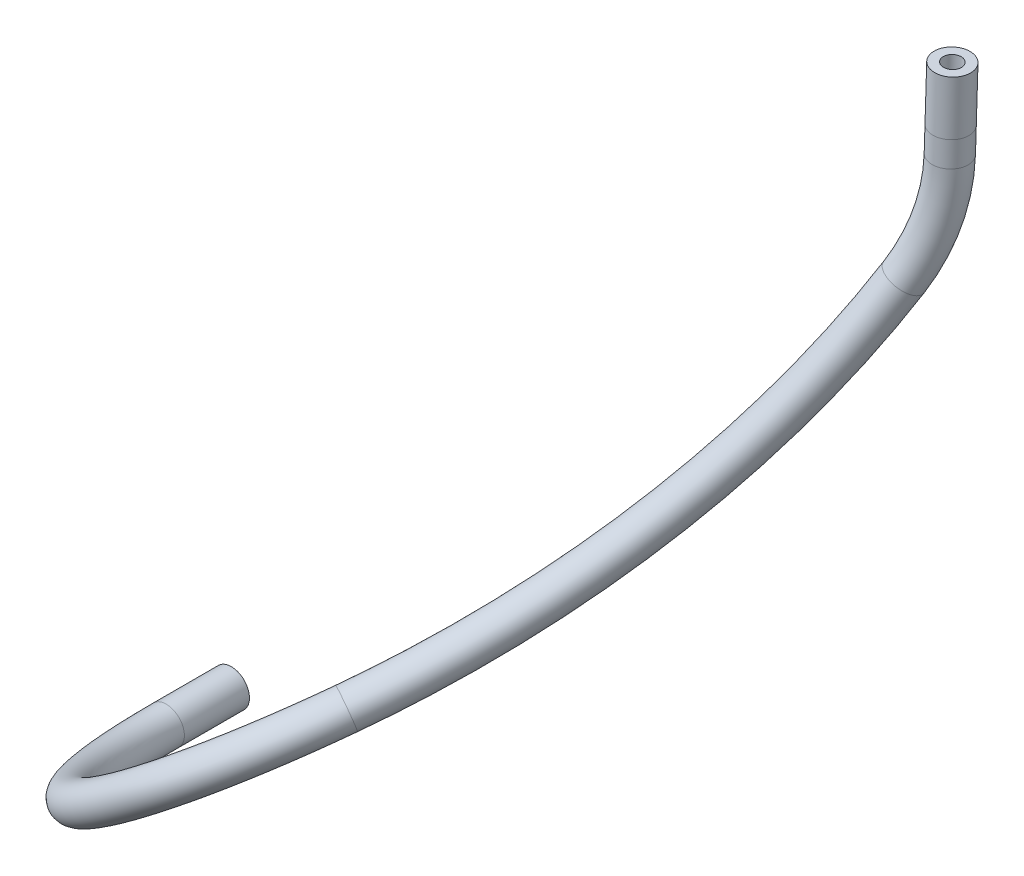
ISO-10303-21;
HEADER;
FILE_DESCRIPTION(('STEP AP214'),'2;1');
FILE_NAME('part.step','',(''),(''),'','','');
FILE_SCHEMA(('AUTOMOTIVE_DESIGN { 1 0 10303 214 1 1 1 1 }'));
ENDSEC;
DATA;
#1=APPLICATION_CONTEXT('core data for automotive mechanical design processes');
#2=APPLICATION_PROTOCOL_DEFINITION('international standard','automotive_design',2000,#1);
#3=PRODUCT_CONTEXT('',#1,'mechanical');
#4=PRODUCT('Part','Part','',(#3));
#5=PRODUCT_RELATED_PRODUCT_CATEGORY('part','',(#4));
#6=PRODUCT_DEFINITION_FORMATION('','',#4);
#7=PRODUCT_DEFINITION_CONTEXT('part definition',#1,'design');
#8=PRODUCT_DEFINITION('design','',#6,#7);
#9=PRODUCT_DEFINITION_SHAPE('','',#8);
#10=(LENGTH_UNIT() NAMED_UNIT(*) SI_UNIT(.MILLI.,.METRE.));
#11=(NAMED_UNIT(*) PLANE_ANGLE_UNIT() SI_UNIT($,.RADIAN.));
#12=(NAMED_UNIT(*) SI_UNIT($,.STERADIAN.) SOLID_ANGLE_UNIT());
#13=UNCERTAINTY_MEASURE_WITH_UNIT(LENGTH_MEASURE(1.E-05),#10,'distance_accuracy_value','');
#14=(GEOMETRIC_REPRESENTATION_CONTEXT(3) GLOBAL_UNCERTAINTY_ASSIGNED_CONTEXT((#13)) GLOBAL_UNIT_ASSIGNED_CONTEXT((#10,
#11,#12)) REPRESENTATION_CONTEXT('',''));
#15=CARTESIAN_POINT('',(0.,0.,0.));
#16=DIRECTION('',(0.,0.,1.));
#17=DIRECTION('',(1.,0.,0.));
#18=AXIS2_PLACEMENT_3D('',#15,#16,#17);
#19=CARTESIAN_POINT('',(233.82329013357,271.78645618805,-75.5066206363869));
#20=DIRECTION('',(0.0248269064084974,0.999669775287712,-0.00663061795004285));
#21=DIRECTION('',(0.211207580612371,-0.0117280765466602,-0.977370866208106));
#22=AXIS2_PLACEMENT_3D('',#19,#20,#21);
#23=PLANE('',#22);
#24=CARTESIAN_POINT('',(233.82329013357,271.78645618805,-75.5066206363869));
#25=DIRECTION('',(0.0248269064084974,0.999669775287712,-0.00663061795004285));
#26=DIRECTION('',(-0.999691751300367,0.0248274521851357,0.));
#27=AXIS2_PLACEMENT_3D('',#24,#25,#26);
#28=CIRCLE('',#27,3.175);
#29=CARTESIAN_POINT('',(230.649268823191,271.865283348737,-75.5066206363869));
#30=VERTEX_POINT('',#29);
#31=EDGE_CURVE('E98',#30,#30,#28,.T.);
#32=ORIENTED_EDGE('',*,*,#31,.F.);
#33=EDGE_LOOP('',(#32));
#34=FACE_BOUND('',#33,.T.);
#35=CARTESIAN_POINT('',(233.82329013357,271.78645618805,-75.5066206363869));
#36=DIRECTION('',(0.0248269064084974,0.999669775287712,-0.00663061795004285));
#37=DIRECTION('',(0.211207580612371,-0.0117280765466602,-0.977370866208106));
#38=AXIS2_PLACEMENT_3D('',#35,#36,#37);
#39=CIRCLE('',#38,6.35);
#40=CARTESIAN_POINT('',(240.171332754327,271.628801866674,-75.5066206363869));
#41=VERTEX_POINT('',#40);
#42=EDGE_CURVE('E95',#41,#41,#39,.T.);
#43=ORIENTED_EDGE('',*,*,#42,.T.);
#44=EDGE_LOOP('',(#43));
#45=FACE_BOUND('',#44,.T.);
#46=ADVANCED_FACE('F60',(#34,#45),#23,.T.);
#47=CARTESIAN_POINT('',(44.0922322704947,18.6667973883187,-12.9773341547457));
#48=DIRECTION('',(-2.80819323838567E-12,0.,1.));
#49=DIRECTION('',(1.,0.,2.80819323838567E-12));
#50=AXIS2_PLACEMENT_3D('',#47,#48,#49);
#51=PLANE('',#50);
#52=CARTESIAN_POINT('',(44.0922322705182,18.6667973883361,-12.9773341547457));
#53=DIRECTION('',(-2.80819323838567E-12,0.,1.));
#54=DIRECTION('',(1.,0.,2.80819323838567E-12));
#55=AXIS2_PLACEMENT_3D('',#52,#53,#54);
#56=CIRCLE('',#55,3.175);
#57=CARTESIAN_POINT('',(47.2672322705182,18.6667973883361,-12.9773341547368));
#58=VERTEX_POINT('',#57);
#59=EDGE_CURVE('E102',#58,#58,#56,.T.);
#60=ORIENTED_EDGE('',*,*,#59,.T.);
#61=EDGE_LOOP('',(#60));
#62=FACE_BOUND('',#61,.T.);
#63=CARTESIAN_POINT('',(44.0922322704947,18.6667973883187,-12.9773341547457));
#64=DIRECTION('',(-2.80819323838567E-12,0.,1.));
#65=DIRECTION('',(1.,0.,2.80819323838567E-12));
#66=AXIS2_PLACEMENT_3D('',#63,#64,#65);
#67=CIRCLE('',#66,6.35);
#68=CARTESIAN_POINT('',(50.4422322704947,18.6667973883187,-12.9773341547279));
#69=VERTEX_POINT('',#68);
#70=EDGE_CURVE('E11',#69,#69,#67,.T.);
#71=ORIENTED_EDGE('',*,*,#70,.F.);
#72=EDGE_LOOP('',(#71));
#73=FACE_BOUND('',#72,.T.);
#74=ADVANCED_FACE('F127',(#62,#73),#51,.F.);
#75=CARTESIAN_POINT('',(233.82329013357,271.78645618805,-75.5066206363869));
#76=DIRECTION('',(-0.0248269064084972,-0.999669775287712,0.00663061795004133));
#77=DIRECTION('',(0.999691751300367,-0.0248274521851356,0.));
#78=AXIS2_PLACEMENT_3D('',#75,#76,#77);
#79=CYLINDRICAL_SURFACE('',#78,6.35);
#80=CARTESIAN_POINT('',(233.347766262703,252.639211931707,-75.3796206363886));
#81=DIRECTION('',(0.0248269064084974,0.999669775287712,-0.00663061795004285));
#82=DIRECTION('',(0.211207580612371,-0.0117280765466602,-0.977370866208106));
#83=AXIS2_PLACEMENT_3D('',#80,#81,#82);
#84=CIRCLE('',#83,6.35);
#85=CARTESIAN_POINT('',(239.695808883461,252.481557610331,-75.3796206363886));
#86=VERTEX_POINT('',#85);
#87=EDGE_CURVE('E91',#86,#86,#84,.T.);
#88=CARTESIAN_POINT('',(239.695808883461,252.481557610331,-75.3796206363886));
#89=CARTESIAN_POINT('',(239.700762257115,252.681008071335,-75.3809435530552));
#90=CARTESIAN_POINT('',(239.70571563077,252.880458532338,-75.3822664697218));
#91=CARTESIAN_POINT('',(239.71562237808,253.279359454345,-75.3849123030551));
#92=CARTESIAN_POINT('',(239.720575751735,253.478809915349,-75.3862352197218));
#93=CARTESIAN_POINT('',(239.730482499045,253.877710837356,-75.3888810530551));
#94=CARTESIAN_POINT('',(239.735435872699,254.07716129836,-75.3902039697218));
#95=CARTESIAN_POINT('',(239.745342620009,254.476062220367,-75.392849803055));
#96=CARTESIAN_POINT('',(239.750295993664,254.675512681371,-75.3941727197217));
#97=CARTESIAN_POINT('',(239.760202740974,255.074413603378,-75.396818553055));
#98=CARTESIAN_POINT('',(239.765156114629,255.273864064381,-75.3981414697217));
#99=CARTESIAN_POINT('',(239.775062861938,255.672764986388,-75.4007873030549));
#100=CARTESIAN_POINT('',(239.780016235593,255.872215447392,-75.4021102197216));
#101=CARTESIAN_POINT('',(239.789922982903,256.271116369399,-75.4047560530549));
#102=CARTESIAN_POINT('',(239.794876356558,256.470566830403,-75.4060789697215));
#103=CARTESIAN_POINT('',(239.804783103867,256.86946775241,-75.4087248030548));
#104=CARTESIAN_POINT('',(239.809736477522,257.068918213413,-75.4100477197215));
#105=CARTESIAN_POINT('',(239.819643224832,257.46781913542,-75.4126935530548));
#106=CARTESIAN_POINT('',(239.824596598487,257.667269596424,-75.4140164697214));
#107=CARTESIAN_POINT('',(239.834503345797,258.066170518431,-75.4166623030548));
#108=CARTESIAN_POINT('',(239.839456719451,258.265620979435,-75.4179852197214));
#109=CARTESIAN_POINT('',(239.849363466761,258.664521901442,-75.4206310530547));
#110=CARTESIAN_POINT('',(239.854316840416,258.863972362446,-75.4219539697213));
#111=CARTESIAN_POINT('',(239.864223587726,259.262873284453,-75.4245998030546));
#112=CARTESIAN_POINT('',(239.869176961381,259.462323745456,-75.4259227197213));
#113=CARTESIAN_POINT('',(239.87908370869,259.861224667463,-75.4285685530546));
#114=CARTESIAN_POINT('',(239.884037082345,260.060675128467,-75.4298914697212));
#115=CARTESIAN_POINT('',(239.893943829655,260.459576050474,-75.4325373030545));
#116=CARTESIAN_POINT('',(239.89889720331,260.659026511478,-75.4338602197212));
#117=CARTESIAN_POINT('',(239.908803950619,261.057927433485,-75.4365060530545));
#118=CARTESIAN_POINT('',(239.913757324274,261.257377894488,-75.4378289697212));
#119=CARTESIAN_POINT('',(239.923664071584,261.656278816495,-75.4404748030544));
#120=CARTESIAN_POINT('',(239.928617445239,261.855729277499,-75.4417977197211));
#121=CARTESIAN_POINT('',(239.938524192549,262.254630199506,-75.4444435530544));
#122=CARTESIAN_POINT('',(239.943477566203,262.45408066051,-75.4457664697211));
#123=CARTESIAN_POINT('',(239.953384313513,262.852981582517,-75.4484123030543));
#124=CARTESIAN_POINT('',(239.958337687168,263.05243204352,-75.449735219721));
#125=CARTESIAN_POINT('',(239.968244434478,263.451332965528,-75.4523810530543));
#126=CARTESIAN_POINT('',(239.973197808133,263.650783426531,-75.4537039697209));
#127=CARTESIAN_POINT('',(239.983104555442,264.049684348538,-75.4563498030543));
#128=CARTESIAN_POINT('',(239.988057929097,264.249134809542,-75.4576727197209));
#129=CARTESIAN_POINT('',(239.997964676407,264.648035731549,-75.4603185530542));
#130=CARTESIAN_POINT('',(240.002918050062,264.847486192553,-75.4616414697208));
#131=CARTESIAN_POINT('',(240.012824797371,265.24638711456,-75.4642873030541));
#132=CARTESIAN_POINT('',(240.017778171026,265.445837575563,-75.4656102197208));
#133=CARTESIAN_POINT('',(240.027684918336,265.84473849757,-75.4682560530541));
#134=CARTESIAN_POINT('',(240.032638291991,266.044188958574,-75.4695789697207));
#135=CARTESIAN_POINT('',(240.042545039301,266.443089880581,-75.472224803054));
#136=CARTESIAN_POINT('',(240.047498412955,266.642540341585,-75.4735477197207));
#137=CARTESIAN_POINT('',(240.057405160265,267.041441263592,-75.476193553054));
#138=CARTESIAN_POINT('',(240.06235853392,267.240891724595,-75.4775164697206));
#139=CARTESIAN_POINT('',(240.07226528123,267.639792646603,-75.4801623030539));
#140=CARTESIAN_POINT('',(240.077218654885,267.839243107606,-75.4814852197206));
#141=CARTESIAN_POINT('',(240.087125402194,268.238144029613,-75.4841310530539));
#142=CARTESIAN_POINT('',(240.092078775849,268.437594490617,-75.4854539697206));
#143=CARTESIAN_POINT('',(240.101985523159,268.836495412624,-75.4880998030538));
#144=CARTESIAN_POINT('',(240.106938896814,269.035945873628,-75.4894227197205));
#145=CARTESIAN_POINT('',(240.116845644123,269.434846795635,-75.4920685530538));
#146=CARTESIAN_POINT('',(240.121799017778,269.634297256638,-75.4933914697205));
#147=CARTESIAN_POINT('',(240.131705765088,270.033198178645,-75.4960373030537));
#148=CARTESIAN_POINT('',(240.136659138743,270.232648639649,-75.4973602197204));
#149=CARTESIAN_POINT('',(240.146565886053,270.631549561656,-75.5000060530537));
#150=CARTESIAN_POINT('',(240.151519259707,270.83100002266,-75.5013289697203));
#151=CARTESIAN_POINT('',(240.161426007017,271.229900944667,-75.5039748030537));
#152=CARTESIAN_POINT('',(240.166379380672,271.429351405671,-75.5052977197203));
#153=CARTESIAN_POINT('',(240.171332754327,271.628801866674,-75.5066206363869));
#154=B_SPLINE_CURVE_WITH_KNOTS('',3,(#88,#89,#90,#91,#92,#93,#94,#95,#96,#97,#98,#99,#100,#101,
#102,#103,#104,#105,#106,#107,#108,#109,#110,#111,#112,#113,#114,#115,#116,#117,#118,#119,#120,
#121,#122,#123,#124,#125,#126,#127,#128,#129,#130,#131,#132,#133,#134,#135,#136,#137,#138,#139,
#140,#141,#142,#143,#144,#145,#146,#147,#148,#149,#150,#151,#152,#153),.UNSPECIFIED.,.F.,.F.,(4,
2,2,2,2,2,2,2,2,2,2,2,2,2,2,2,2,2,2,2,2,2,2,2,2,2,2,2,2,2,2,2,4),(0.,0.598549038694825,
1.19709807738965,1.79564711608442,2.39419615477924,2.99274519347407,3.59129423216884,
4.18984327086366,4.78839230955848,5.38694134825325,5.98549038694808,6.5840394256429,
7.18258846433767,7.7811375030325,8.37968654172732,8.97823558042209,9.57678461911692,
10.1753336578117,10.7738826965065,11.3724317352013,11.9709807738962,12.5695298125909,
13.1680788512858,13.7666278899806,14.3651769286753,14.9637259673702,15.562275006065,
16.1608240447598,16.7593730834546,17.3579221221494,17.9564711608442,18.555020199539,
19.1535692382338),.UNSPECIFIED.);
#155=EDGE_CURVE('BSEAM171',#86,#41,#154,.T.);
#156=ORIENTED_EDGE('',*,*,#87,.T.);
#157=ORIENTED_EDGE('',*,*,#42,.F.);
#158=ORIENTED_EDGE('',*,*,#155,.T.);
#159=ORIENTED_EDGE('',*,*,#155,.F.);
#160=EDGE_LOOP('',(#156,#158,#157,#159));
#161=FACE_BOUND('',#160,.T.);
#162=ADVANCED_FACE('F171',(#161),#79,.T.);
#163=CARTESIAN_POINT('',(233.347766262703,252.639211931707,-75.3796206363886));
#164=DIRECTION('',(-0.0248269064095722,-0.999669775287661,0.00663061795368347));
#165=DIRECTION('',(0.99969175130034,-0.0248274521862112,0.));
#166=AXIS2_PLACEMENT_3D('',#163,#164,#165);
#167=CYLINDRICAL_SURFACE('',#166,6.35);
#168=CARTESIAN_POINT('',(233.124989375618,243.668971460429,-75.3201227511988));
#169=DIRECTION('',(0.0248269064095724,0.999669775287661,-0.00663061795368499));
#170=DIRECTION('',(0.211207580612277,-0.0117280765504463,-0.977370866208081));
#171=AXIS2_PLACEMENT_3D('',#168,#169,#170);
#172=CIRCLE('',#171,6.35);
#173=CARTESIAN_POINT('',(237.500197269959,243.529801287975,-79.9201974836746));
#174=VERTEX_POINT('',#173);
#175=EDGE_CURVE('E87',#174,#174,#172,.T.);
#176=ORIENTED_EDGE('',*,*,#175,.T.);
#177=EDGE_LOOP('',(#176));
#178=FACE_BOUND('',#177,.T.);
#179=ORIENTED_EDGE('',*,*,#87,.F.);
#180=EDGE_LOOP('',(#179));
#181=FACE_BOUND('',#180,.T.);
#182=ADVANCED_FACE('F173',(#178,#181),#167,.T.);
#183=CARTESIAN_POINT('',(183.036372332097,245.26223094439,-22.6571665646851));
#184=DIRECTION('',(-0.724327316278205,0.0134165815503773,-0.689325709830059));
#185=DIRECTION('',(-0.689387759127242,0.,0.724392516226886));
#186=AXIS2_PLACEMENT_3D('',#183,#184,#185);
#187=TOROIDAL_SURFACE('',#186,72.6965954320974,6.35);
#188=CARTESIAN_POINT('',(224.914532295064,206.184188108808,-67.4223458190401));
#189=DIRECTION('',(0.378808596617332,0.843125240330124,-0.381633169741675));
#190=DIRECTION('',(0.114777155051631,-0.451980497966451,-0.884612815946193));
#191=AXIS2_PLACEMENT_3D('',#188,#189,#190);
#192=CIRCLE('',#191,6.35);
#193=CARTESIAN_POINT('',(228.572562140674,202.770746660401,-71.3325549089647));
#194=VERTEX_POINT('',#193);
#195=EDGE_CURVE('E81',#194,#194,#192,.T.);
#196=CARTESIAN_POINT('',(183.036372332097,245.26223094439,-22.6571665646851));
#197=DIRECTION('',(-0.724327316278205,0.0134165815503773,-0.689325709830059));
#198=DIRECTION('',(-0.689387759127242,0.,0.724392516226886));
#199=AXIS2_PLACEMENT_3D('',#196,#197,#198);
#200=CIRCLE('',#199,79.0465954320973);
#201=EDGE_CURVE('',#174,#194,#200,.T.);
#202=ORIENTED_EDGE('',*,*,#175,.F.);
#203=ORIENTED_EDGE('',*,*,#195,.T.);
#204=ORIENTED_EDGE('',*,*,#201,.T.);
#205=ORIENTED_EDGE('',*,*,#201,.F.);
#206=EDGE_LOOP('',(#202,#204,#203,#205));
#207=FACE_BOUND('',#206,.T.);
#208=ADVANCED_FACE('F180',(#207),#187,.T.);
#209=CARTESIAN_POINT('',(159.958091689006,334.918342009455,152.508632391665));
#210=DIRECTION('',(-0.891906361506889,0.222530054119756,-0.393679333108815));
#211=DIRECTION('',(-0.403804392893333,0.,0.914845348832275));
#212=AXIS2_PLACEMENT_3D('',#209,#210,#211);
#213=TOROIDAL_SURFACE('',#212,262.985658798045,6.35);
#214=CARTESIAN_POINT('',(145.777808920758,93.8475838717442,48.3680260703865));
#215=DIRECTION('',(0.44899402726407,0.331961770860957,-0.829581669378036));
#216=DIRECTION('',(-0.182945729970724,-0.874605753107253,-0.44899402726225));
#217=AXIS2_PLACEMENT_3D('',#214,#215,#216);
#218=CIRCLE('',#217,6.35);
#219=CARTESIAN_POINT('',(150.013647317282,96.9793324693146,51.9137733541244));
#220=VERTEX_POINT('',#219);
#221=EDGE_CURVE('E74',#220,#220,#218,.T.);
#222=ORIENTED_EDGE('',*,*,#221,.T.);
#223=EDGE_LOOP('',(#222));
#224=FACE_BOUND('',#223,.T.);
#225=ORIENTED_EDGE('',*,*,#195,.F.);
#226=EDGE_LOOP('',(#225));
#227=FACE_BOUND('',#226,.T.);
#228=ADVANCED_FACE('F189',(#224,#227),#213,.T.);
#229=CARTESIAN_POINT('',(99.6708261929062,59.758587791383,9.77266584541044));
#230=DIRECTION('',(0.594502957004772,-0.804093423746633,1.67025890656978E-12));
#231=DIRECTION('',(0.804093423746633,0.594502957004772,0.));
#232=AXIS2_PLACEMENT_3D('',#229,#230,#231);
#233=TOROIDAL_SURFACE('',#232,69.1195727773892,6.35);
#234=CARTESIAN_POINT('',(44.0922322704543,18.6667973883361,9.77266584551562));
#235=DIRECTION('',(-2.80819323838567E-12,0.,1.));
#236=DIRECTION('',(1.,0.,2.80819323838567E-12));
#237=AXIS2_PLACEMENT_3D('',#234,#235,#236);
#238=CIRCLE('',#237,6.35);
#239=CARTESIAN_POINT('',(38.9862390296396,14.8917036113383,9.77266584552528));
#240=VERTEX_POINT('',#239);
#241=EDGE_CURVE('E67',#240,#240,#238,.T.);
#242=CARTESIAN_POINT('',(99.6708261929062,59.758587791383,9.77266584541044));
#243=DIRECTION('',(0.594502957004772,-0.804093423746633,1.67025890656978E-12));
#244=DIRECTION('',(0.804093423746633,0.594502957004772,0.));
#245=AXIS2_PLACEMENT_3D('',#242,#243,#244);
#246=CIRCLE('',#245,75.4695727773892);
#247=EDGE_CURVE('',#220,#240,#246,.T.);
#248=ORIENTED_EDGE('',*,*,#221,.F.);
#249=ORIENTED_EDGE('',*,*,#241,.T.);
#250=ORIENTED_EDGE('',*,*,#247,.T.);
#251=ORIENTED_EDGE('',*,*,#247,.F.);
#252=EDGE_LOOP('',(#248,#250,#249,#251));
#253=FACE_BOUND('',#252,.T.);
#254=ADVANCED_FACE('F184',(#253),#233,.T.);
#255=CARTESIAN_POINT('',(44.0922322704308,18.6667973883187,9.77266584525427));
#256=DIRECTION('',(2.8097182700129E-12,0.,-1.));
#257=DIRECTION('',(-1.,0.,-2.8097182700129E-12));
#258=AXIS2_PLACEMENT_3D('',#255,#256,#257);
#259=CYLINDRICAL_SURFACE('',#258,6.35);
#260=ORIENTED_EDGE('',*,*,#70,.T.);
#261=EDGE_LOOP('',(#260));
#262=FACE_BOUND('',#261,.T.);
#263=ORIENTED_EDGE('',*,*,#241,.F.);
#264=EDGE_LOOP('',(#263));
#265=FACE_BOUND('',#264,.T.);
#266=ADVANCED_FACE('F163',(#262,#265),#259,.T.);
#267=CARTESIAN_POINT('',(233.947424665612,276.784805064488,-75.5397737261371));
#268=DIRECTION('',(-0.0248269064084974,-0.999669775287712,0.00663061795004109));
#269=DIRECTION('',(0.999691751300367,-0.0248274521851357,0.));
#270=AXIS2_PLACEMENT_3D('',#267,#268,#269);
#271=CYLINDRICAL_SURFACE('',#270,3.175);
#272=CARTESIAN_POINT('',(233.347766262703,252.639211931707,-75.3796206363885));
#273=DIRECTION('',(0.0248269064084951,0.999669775287712,-0.00663061795004299));
#274=DIRECTION('',(0.211207580612371,-0.0117280765466599,-0.977370866208106));
#275=AXIS2_PLACEMENT_3D('',#272,#273,#274);
#276=CIRCLE('',#275,3.175);
#277=CARTESIAN_POINT('',(234.018350331148,252.601975288671,-78.4827731365993));
#278=VERTEX_POINT('',#277);
#279=EDGE_CURVE('E119',#278,#278,#276,.T.);
#280=ORIENTED_EDGE('',*,*,#279,.F.);
#281=EDGE_LOOP('',(#280));
#282=FACE_BOUND('',#281,.T.);
#283=ORIENTED_EDGE('',*,*,#31,.T.);
#284=EDGE_LOOP('',(#283));
#285=FACE_BOUND('',#284,.T.);
#286=ADVANCED_FACE('F135',(#282,#285),#271,.F.);
#287=CARTESIAN_POINT('',(233.347766262703,252.639211931707,-75.3796206363885));
#288=DIRECTION('',(-0.0248269064095722,-0.999669775287661,0.00663061795368347));
#289=DIRECTION('',(0.99969175130034,-0.0248274521862112,0.));
#290=AXIS2_PLACEMENT_3D('',#287,#288,#289);
#291=CYLINDRICAL_SURFACE('',#290,3.175);
#292=CARTESIAN_POINT('',(233.124989375618,243.668971460429,-75.3201227511988));
#293=DIRECTION('',(0.0248269064095722,0.999669775287661,-0.00663061795368536));
#294=DIRECTION('',(0.211207580612277,-0.0117280765504466,-0.977370866208081));
#295=AXIS2_PLACEMENT_3D('',#292,#293,#294);
#296=CIRCLE('',#295,3.175);
#297=CARTESIAN_POINT('',(235.312593322787,243.599386374202,-77.6201601174357));
#298=VERTEX_POINT('',#297);
#299=EDGE_CURVE('E115',#298,#298,#296,.T.);
#300=ORIENTED_EDGE('',*,*,#299,.F.);
#301=EDGE_LOOP('',(#300));
#302=FACE_BOUND('',#301,.T.);
#303=ORIENTED_EDGE('',*,*,#279,.T.);
#304=EDGE_LOOP('',(#303));
#305=FACE_BOUND('',#304,.T.);
#306=ADVANCED_FACE('F152',(#302,#305),#291,.F.);
#307=CARTESIAN_POINT('',(183.036372332097,245.26223094439,-22.6571665646851));
#308=DIRECTION('',(-0.724327316278205,0.0134165815503773,-0.689325709830059));
#309=DIRECTION('',(-0.689387759127242,0.,0.724392516226886));
#310=AXIS2_PLACEMENT_3D('',#307,#308,#309);
#311=TOROIDAL_SURFACE('',#310,72.6965954320974,3.175);
#312=CARTESIAN_POINT('',(224.914532295064,206.184188108808,-67.4223458190401));
#313=DIRECTION('',(0.378808596617332,0.843125240330124,-0.381633169741676));
#314=DIRECTION('',(0.114777155051631,-0.451980497966451,-0.884612815946193));
#315=AXIS2_PLACEMENT_3D('',#312,#313,#314);
#316=CIRCLE('',#315,3.175);
#317=CARTESIAN_POINT('',(226.743547217869,204.477467384604,-69.3774503640024));
#318=VERTEX_POINT('',#317);
#319=EDGE_CURVE('E111',#318,#318,#316,.T.);
#320=CARTESIAN_POINT('',(183.036372332097,245.26223094439,-22.6571665646851));
#321=DIRECTION('',(-0.724327316278205,0.0134165815503773,-0.689325709830059));
#322=DIRECTION('',(-0.689387759127242,0.,0.724392516226886));
#323=AXIS2_PLACEMENT_3D('',#320,#321,#322);
#324=CIRCLE('',#323,75.8715954320974);
#325=EDGE_CURVE('',#298,#318,#324,.T.);
#326=ORIENTED_EDGE('',*,*,#299,.T.);
#327=ORIENTED_EDGE('',*,*,#319,.F.);
#328=ORIENTED_EDGE('',*,*,#325,.T.);
#329=ORIENTED_EDGE('',*,*,#325,.F.);
#330=EDGE_LOOP('',(#326,#328,#327,#329));
#331=FACE_BOUND('',#330,.T.);
#332=ADVANCED_FACE('F146',(#331),#311,.F.);
#333=CARTESIAN_POINT('',(159.958091689006,334.918342009455,152.508632391665));
#334=DIRECTION('',(-0.891906361506889,0.222530054119756,-0.393679333108815));
#335=DIRECTION('',(-0.403804392893333,0.,0.914845348832275));
#336=AXIS2_PLACEMENT_3D('',#333,#334,#335);
#337=TOROIDAL_SURFACE('',#336,262.985658798045,3.175);
#338=CARTESIAN_POINT('',(145.777808920758,93.8475838717442,48.3680260703865));
#339=DIRECTION('',(0.448994027264069,0.331961770860957,-0.829581669378036));
#340=DIRECTION('',(-0.182945729970724,-0.874605753107253,-0.44899402726225));
#341=AXIS2_PLACEMENT_3D('',#338,#339,#340);
#342=CIRCLE('',#341,3.175);
#343=CARTESIAN_POINT('',(147.895728119019,95.4134581705292,50.1408997122552));
#344=VERTEX_POINT('',#343);
#345=EDGE_CURVE('E107',#344,#344,#342,.T.);
#346=ORIENTED_EDGE('',*,*,#345,.F.);
#347=EDGE_LOOP('',(#346));
#348=FACE_BOUND('',#347,.T.);
#349=ORIENTED_EDGE('',*,*,#319,.T.);
#350=EDGE_LOOP('',(#349));
#351=FACE_BOUND('',#350,.T.);
#352=ADVANCED_FACE('F140',(#348,#351),#337,.F.);
#353=CARTESIAN_POINT('',(99.6708261929062,59.7585877913831,9.77266584541044));
#354=DIRECTION('',(0.594502957004772,-0.804093423746633,1.67025890656978E-12));
#355=DIRECTION('',(0.804093423746633,0.594502957004772,0.));
#356=AXIS2_PLACEMENT_3D('',#353,#354,#355);
#357=TOROIDAL_SURFACE('',#356,69.1195727773892,3.175);
#358=CARTESIAN_POINT('',(44.0922322704543,18.6667973883361,9.77266584551564));
#359=DIRECTION('',(-2.80819323838567E-12,0.,1.));
#360=DIRECTION('',(1.,0.,2.80819323838567E-12));
#361=AXIS2_PLACEMENT_3D('',#358,#359,#360);
#362=CIRCLE('',#361,3.175);
#363=CARTESIAN_POINT('',(41.5392356500352,16.7792504998285,9.77266584552047));
#364=VERTEX_POINT('',#363);
#365=EDGE_CURVE('E103',#364,#364,#362,.T.);
#366=CARTESIAN_POINT('',(99.6708261929062,59.7585877913831,9.77266584541044));
#367=DIRECTION('',(0.594502957004772,-0.804093423746633,1.67025890656978E-12));
#368=DIRECTION('',(0.804093423746633,0.594502957004772,0.));
#369=AXIS2_PLACEMENT_3D('',#366,#367,#368);
#370=CIRCLE('',#369,72.2945727773892);
#371=EDGE_CURVE('',#344,#364,#370,.T.);
#372=ORIENTED_EDGE('',*,*,#345,.T.);
#373=ORIENTED_EDGE('',*,*,#365,.F.);
#374=ORIENTED_EDGE('',*,*,#371,.T.);
#375=ORIENTED_EDGE('',*,*,#371,.F.);
#376=EDGE_LOOP('',(#372,#374,#373,#375));
#377=FACE_BOUND('',#376,.T.);
#378=ADVANCED_FACE('F133',(#377),#357,.F.);
#379=CARTESIAN_POINT('',(44.0922322704543,18.6667973883361,9.77266584543753));
#380=DIRECTION('',(2.80979808475227E-12,0.,-1.));
#381=DIRECTION('',(-1.,0.,-2.80979808475227E-12));
#382=AXIS2_PLACEMENT_3D('',#379,#380,#381);
#383=CYLINDRICAL_SURFACE('',#382,3.175);
#384=ORIENTED_EDGE('',*,*,#59,.F.);
#385=EDGE_LOOP('',(#384));
#386=FACE_BOUND('',#385,.T.);
#387=ORIENTED_EDGE('',*,*,#365,.T.);
#388=EDGE_LOOP('',(#387));
#389=FACE_BOUND('',#388,.T.);
#390=ADVANCED_FACE('F130',(#386,#389),#383,.F.);
#391=CLOSED_SHELL('',(#46,#74,#162,#182,#208,#228,#254,#266,#286,#306,#332,#352,#378,#390));
#392=MANIFOLD_SOLID_BREP('B2',#391);
#393=ADVANCED_BREP_SHAPE_REPRESENTATION('',(#18,#392),#14);
#394=SHAPE_DEFINITION_REPRESENTATION(#9,#393);
ENDSEC;
END-ISO-10303-21;
